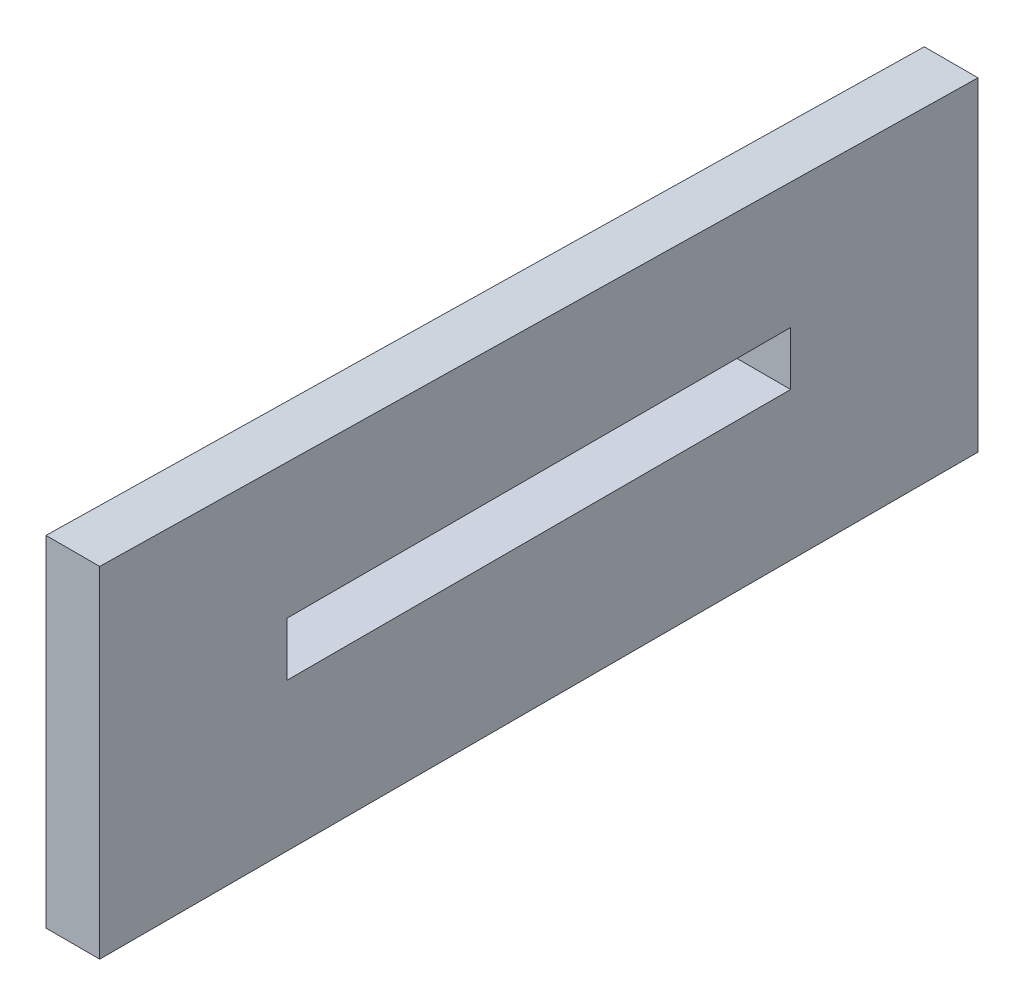
ISO-10303-21;
HEADER;
FILE_DESCRIPTION(('STEP AP214'),'2;1');
FILE_NAME('part.step','',(''),(''),'','','');
FILE_SCHEMA(('AUTOMOTIVE_DESIGN { 1 0 10303 214 1 1 1 1 }'));
ENDSEC;
DATA;
#1=APPLICATION_CONTEXT('core data for automotive mechanical design processes');
#2=APPLICATION_PROTOCOL_DEFINITION('international standard','automotive_design',2000,#1);
#3=PRODUCT_CONTEXT('',#1,'mechanical');
#4=PRODUCT('Part','Part','',(#3));
#5=PRODUCT_RELATED_PRODUCT_CATEGORY('part','',(#4));
#6=PRODUCT_DEFINITION_FORMATION('','',#4);
#7=PRODUCT_DEFINITION_CONTEXT('part definition',#1,'design');
#8=PRODUCT_DEFINITION('design','',#6,#7);
#9=PRODUCT_DEFINITION_SHAPE('','',#8);
#10=(LENGTH_UNIT() NAMED_UNIT(*) SI_UNIT(.MILLI.,.METRE.));
#11=(NAMED_UNIT(*) PLANE_ANGLE_UNIT() SI_UNIT($,.RADIAN.));
#12=(NAMED_UNIT(*) SI_UNIT($,.STERADIAN.) SOLID_ANGLE_UNIT());
#13=UNCERTAINTY_MEASURE_WITH_UNIT(LENGTH_MEASURE(1.E-05),#10,'distance_accuracy_value','');
#14=(GEOMETRIC_REPRESENTATION_CONTEXT(3) GLOBAL_UNCERTAINTY_ASSIGNED_CONTEXT((#13)) GLOBAL_UNIT_ASSIGNED_CONTEXT((#10,
#11,#12)) REPRESENTATION_CONTEXT('',''));
#15=CARTESIAN_POINT('',(0.,0.,0.));
#16=DIRECTION('',(0.,0.,1.));
#17=DIRECTION('',(1.,0.,0.));
#18=AXIS2_PLACEMENT_3D('',#15,#16,#17);
#19=CARTESIAN_POINT('',(3.175,0.,0.));
#20=DIRECTION('',(1.,0.,0.));
#21=DIRECTION('',(0.,0.,-1.));
#22=AXIS2_PLACEMENT_3D('',#19,#20,#21);
#23=PLANE('',#22);
#24=DIRECTION('',(0.,-1.,0.));
#25=VECTOR('',#24,1.);
#26=CARTESIAN_POINT('',(3.175,10.525064421,25.953850429));
#27=LINE('',#26,#25);
#28=CARTESIAN_POINT('',(3.175,10.525064421,25.953850429));
#29=VERTEX_POINT('',#28);
#30=CARTESIAN_POINT('',(3.175,-9.579468141,25.953850429));
#31=VERTEX_POINT('',#30);
#32=EDGE_CURVE('E141',#29,#31,#27,.T.);
#33=ORIENTED_EDGE('',*,*,#32,.T.);
#34=DIRECTION('',(0.,0.,-1.));
#35=VECTOR('',#34,1.);
#36=CARTESIAN_POINT('',(3.175,-9.579468141,25.953850429));
#37=LINE('',#36,#35);
#38=CARTESIAN_POINT('',(3.175,-9.579468141,-25.953850429));
#39=VERTEX_POINT('',#38);
#40=EDGE_CURVE('E144',#31,#39,#37,.T.);
#41=ORIENTED_EDGE('',*,*,#40,.T.);
#42=DIRECTION('',(0.,1.,0.));
#43=VECTOR('',#42,1.);
#44=CARTESIAN_POINT('',(3.175,9.579468141,-25.953850429));
#45=LINE('',#44,#43);
#46=CARTESIAN_POINT('',(3.175,9.579468141,-25.953850429));
#47=VERTEX_POINT('',#46);
#48=EDGE_CURVE('E147',#39,#47,#45,.T.);
#49=ORIENTED_EDGE('',*,*,#48,.T.);
#50=DIRECTION('',(0.,0.0182138565789973,0.99983411395517));
#51=VECTOR('',#50,1.);
#52=CARTESIAN_POINT('',(3.175,9.579468141,-25.953850429));
#53=LINE('',#52,#51);
#54=EDGE_CURVE('E149',#47,#29,#53,.T.);
#55=ORIENTED_EDGE('',*,*,#54,.T.);
#56=EDGE_LOOP('',(#33,#41,#49,#55));
#57=FACE_BOUND('',#56,.T.);
#58=DIRECTION('',(0.,0.,-1.));
#59=VECTOR('',#58,1.);
#60=CARTESIAN_POINT('',(3.175,-0.836413491000002,14.881120987));
#61=LINE('',#60,#59);
#62=CARTESIAN_POINT('',(3.175,-0.836413491000002,14.881120987));
#63=VERTEX_POINT('',#62);
#64=CARTESIAN_POINT('',(3.175,-0.836413491000002,-14.881120987));
#65=VERTEX_POINT('',#64);
#66=EDGE_CURVE('E110',#63,#65,#61,.T.);
#67=ORIENTED_EDGE('',*,*,#66,.F.);
#68=DIRECTION('',(0.,-1.,0.));
#69=VECTOR('',#68,1.);
#70=CARTESIAN_POINT('',(3.175,2.338586509,14.881120987));
#71=LINE('',#70,#69);
#72=CARTESIAN_POINT('',(3.175,2.338586509,14.881120987));
#73=VERTEX_POINT('',#72);
#74=EDGE_CURVE('E102',#73,#63,#71,.T.);
#75=ORIENTED_EDGE('',*,*,#74,.F.);
#76=DIRECTION('',(0.,0.,1.));
#77=VECTOR('',#76,1.);
#78=CARTESIAN_POINT('',(3.175,2.338586509,14.881120987));
#79=LINE('',#78,#77);
#80=CARTESIAN_POINT('',(3.175,2.338586509,-14.881120987));
#81=VERTEX_POINT('',#80);
#82=EDGE_CURVE('E125',#81,#73,#79,.T.);
#83=ORIENTED_EDGE('',*,*,#82,.F.);
#84=DIRECTION('',(0.,1.,0.));
#85=VECTOR('',#84,1.);
#86=CARTESIAN_POINT('',(3.175,2.338586509,-14.881120987));
#87=LINE('',#86,#85);
#88=EDGE_CURVE('E122',#65,#81,#87,.T.);
#89=ORIENTED_EDGE('',*,*,#88,.F.);
#90=EDGE_LOOP('',(#67,#75,#83,#89));
#91=FACE_BOUND('',#90,.T.);
#92=ADVANCED_FACE('F37',(#57,#91),#23,.T.);
#93=CARTESIAN_POINT('',(0.,0.,0.));
#94=DIRECTION('',(1.,0.,0.));
#95=DIRECTION('',(0.,0.,-1.));
#96=AXIS2_PLACEMENT_3D('',#93,#94,#95);
#97=PLANE('',#96);
#98=DIRECTION('',(0.,-1.,0.));
#99=VECTOR('',#98,1.);
#100=CARTESIAN_POINT('',(0.,10.525064421,25.953850429));
#101=LINE('',#100,#99);
#102=CARTESIAN_POINT('',(0.,10.525064421,25.953850429));
#103=VERTEX_POINT('',#102);
#104=CARTESIAN_POINT('',(0.,-9.579468141,25.953850429));
#105=VERTEX_POINT('',#104);
#106=EDGE_CURVE('E118',#103,#105,#101,.T.);
#107=ORIENTED_EDGE('',*,*,#106,.F.);
#108=DIRECTION('',(0.,0.0182138565789973,0.99983411395517));
#109=VECTOR('',#108,1.);
#110=CARTESIAN_POINT('',(0.,9.579468141,-25.953850429));
#111=LINE('',#110,#109);
#112=CARTESIAN_POINT('',(0.,9.579468141,-25.953850429));
#113=VERTEX_POINT('',#112);
#114=EDGE_CURVE('E145',#113,#103,#111,.T.);
#115=ORIENTED_EDGE('',*,*,#114,.F.);
#116=DIRECTION('',(0.,1.,0.));
#117=VECTOR('',#116,1.);
#118=CARTESIAN_POINT('',(0.,9.579468141,-25.953850429));
#119=LINE('',#118,#117);
#120=CARTESIAN_POINT('',(0.,-9.579468141,-25.953850429));
#121=VERTEX_POINT('',#120);
#122=EDGE_CURVE('E156',#121,#113,#119,.T.);
#123=ORIENTED_EDGE('',*,*,#122,.F.);
#124=DIRECTION('',(0.,0.,-1.));
#125=VECTOR('',#124,1.);
#126=CARTESIAN_POINT('',(0.,-9.579468141,25.953850429));
#127=LINE('',#126,#125);
#128=EDGE_CURVE('E154',#105,#121,#127,.T.);
#129=ORIENTED_EDGE('',*,*,#128,.F.);
#130=EDGE_LOOP('',(#107,#115,#123,#129));
#131=FACE_BOUND('',#130,.T.);
#132=DIRECTION('',(0.,-1.,0.));
#133=VECTOR('',#132,1.);
#134=CARTESIAN_POINT('',(0.,2.338586509,14.881120987));
#135=LINE('',#134,#133);
#136=CARTESIAN_POINT('',(0.,2.338586509,14.881120987));
#137=VERTEX_POINT('',#136);
#138=CARTESIAN_POINT('',(0.,-0.836413491000002,14.881120987));
#139=VERTEX_POINT('',#138);
#140=EDGE_CURVE('E60',#137,#139,#135,.T.);
#141=ORIENTED_EDGE('',*,*,#140,.T.);
#142=DIRECTION('',(0.,0.,-1.));
#143=VECTOR('',#142,1.);
#144=CARTESIAN_POINT('',(0.,-0.836413491000002,14.881120987));
#145=LINE('',#144,#143);
#146=CARTESIAN_POINT('',(0.,-0.836413491000002,-14.881120987));
#147=VERTEX_POINT('',#146);
#148=EDGE_CURVE('E117',#139,#147,#145,.T.);
#149=ORIENTED_EDGE('',*,*,#148,.T.);
#150=DIRECTION('',(0.,1.,0.));
#151=VECTOR('',#150,1.);
#152=CARTESIAN_POINT('',(0.,2.338586509,-14.881120987));
#153=LINE('',#152,#151);
#154=CARTESIAN_POINT('',(0.,2.338586509,-14.881120987));
#155=VERTEX_POINT('',#154);
#156=EDGE_CURVE('E131',#147,#155,#153,.T.);
#157=ORIENTED_EDGE('',*,*,#156,.T.);
#158=DIRECTION('',(0.,0.,1.));
#159=VECTOR('',#158,1.);
#160=CARTESIAN_POINT('',(0.,2.338586509,14.881120987));
#161=LINE('',#160,#159);
#162=EDGE_CURVE('E111',#155,#137,#161,.T.);
#163=ORIENTED_EDGE('',*,*,#162,.T.);
#164=EDGE_LOOP('',(#141,#149,#157,#163));
#165=FACE_BOUND('',#164,.T.);
#166=ADVANCED_FACE('F174',(#131,#165),#97,.F.);
#167=CARTESIAN_POINT('',(3.175,10.525064421,25.953850429));
#168=DIRECTION('',(0.,0.,-1.));
#169=DIRECTION('',(-1.,0.,0.));
#170=AXIS2_PLACEMENT_3D('',#167,#168,#169);
#171=PLANE('',#170);
#172=ORIENTED_EDGE('',*,*,#106,.T.);
#173=DIRECTION('',(-1.,0.,0.));
#174=VECTOR('',#173,1.);
#175=CARTESIAN_POINT('',(3.175,-9.579468141,25.953850429));
#176=LINE('',#175,#174);
#177=EDGE_CURVE('E11',#31,#105,#176,.T.);
#178=ORIENTED_EDGE('',*,*,#177,.F.);
#179=ORIENTED_EDGE('',*,*,#32,.F.);
#180=DIRECTION('',(-1.,0.,0.));
#181=VECTOR('',#180,1.);
#182=CARTESIAN_POINT('',(3.175,10.525064421,25.953850429));
#183=LINE('',#182,#181);
#184=EDGE_CURVE('E151',#29,#103,#183,.T.);
#185=ORIENTED_EDGE('',*,*,#184,.T.);
#186=EDGE_LOOP('',(#172,#178,#179,#185));
#187=FACE_BOUND('',#186,.T.);
#188=ADVANCED_FACE('F39',(#187),#171,.F.);
#189=CARTESIAN_POINT('',(3.175,-9.579468141,25.953850429));
#190=DIRECTION('',(0.,1.,0.));
#191=DIRECTION('',(0.,0.,1.));
#192=AXIS2_PLACEMENT_3D('',#189,#190,#191);
#193=PLANE('',#192);
#194=ORIENTED_EDGE('',*,*,#128,.T.);
#195=DIRECTION('',(-1.,0.,0.));
#196=VECTOR('',#195,1.);
#197=CARTESIAN_POINT('',(3.175,-9.579468141,-25.953850429));
#198=LINE('',#197,#196);
#199=EDGE_CURVE('E45',#39,#121,#198,.T.);
#200=ORIENTED_EDGE('',*,*,#199,.F.);
#201=ORIENTED_EDGE('',*,*,#40,.F.);
#202=ORIENTED_EDGE('',*,*,#177,.T.);
#203=EDGE_LOOP('',(#194,#200,#201,#202));
#204=FACE_BOUND('',#203,.T.);
#205=ADVANCED_FACE('F184',(#204),#193,.F.);
#206=CARTESIAN_POINT('',(3.175,9.579468141,-25.953850429));
#207=DIRECTION('',(0.,0.,1.));
#208=DIRECTION('',(0.,-1.,0.));
#209=AXIS2_PLACEMENT_3D('',#206,#207,#208);
#210=PLANE('',#209);
#211=ORIENTED_EDGE('',*,*,#122,.T.);
#212=DIRECTION('',(-1.,0.,0.));
#213=VECTOR('',#212,1.);
#214=CARTESIAN_POINT('',(3.175,9.579468141,-25.953850429));
#215=LINE('',#214,#213);
#216=EDGE_CURVE('E161',#47,#113,#215,.T.);
#217=ORIENTED_EDGE('',*,*,#216,.F.);
#218=ORIENTED_EDGE('',*,*,#48,.F.);
#219=ORIENTED_EDGE('',*,*,#199,.T.);
#220=EDGE_LOOP('',(#211,#217,#218,#219));
#221=FACE_BOUND('',#220,.T.);
#222=ADVANCED_FACE('F168',(#221),#210,.F.);
#223=CARTESIAN_POINT('',(3.175,9.579468141,-25.953850429));
#224=DIRECTION('',(0.,-0.99983411395517,0.0182138565789973));
#225=DIRECTION('',(0.,-0.0182138565789973,-0.99983411395517));
#226=AXIS2_PLACEMENT_3D('',#223,#224,#225);
#227=PLANE('',#226);
#228=ORIENTED_EDGE('',*,*,#114,.T.);
#229=ORIENTED_EDGE('',*,*,#184,.F.);
#230=ORIENTED_EDGE('',*,*,#54,.F.);
#231=ORIENTED_EDGE('',*,*,#216,.T.);
#232=EDGE_LOOP('',(#228,#229,#230,#231));
#233=FACE_BOUND('',#232,.T.);
#234=ADVANCED_FACE('F178',(#233),#227,.F.);
#235=CARTESIAN_POINT('',(3.175,2.338586509,14.881120987));
#236=DIRECTION('',(0.,0.,-1.));
#237=DIRECTION('',(-1.,0.,0.));
#238=AXIS2_PLACEMENT_3D('',#235,#236,#237);
#239=PLANE('',#238);
#240=ORIENTED_EDGE('',*,*,#140,.F.);
#241=DIRECTION('',(-1.,0.,0.));
#242=VECTOR('',#241,1.);
#243=CARTESIAN_POINT('',(3.175,2.338586509,14.881120987));
#244=LINE('',#243,#242);
#245=EDGE_CURVE('E106',#73,#137,#244,.T.);
#246=ORIENTED_EDGE('',*,*,#245,.F.);
#247=ORIENTED_EDGE('',*,*,#74,.T.);
#248=DIRECTION('',(-1.,0.,0.));
#249=VECTOR('',#248,1.);
#250=CARTESIAN_POINT('',(3.175,-0.836413491000002,14.881120987));
#251=LINE('',#250,#249);
#252=EDGE_CURVE('E105',#63,#139,#251,.T.);
#253=ORIENTED_EDGE('',*,*,#252,.T.);
#254=EDGE_LOOP('',(#240,#246,#247,#253));
#255=FACE_BOUND('',#254,.T.);
#256=ADVANCED_FACE('F104',(#255),#239,.T.);
#257=CARTESIAN_POINT('',(3.175,-0.836413491000002,14.881120987));
#258=DIRECTION('',(0.,1.,0.));
#259=DIRECTION('',(0.,0.,1.));
#260=AXIS2_PLACEMENT_3D('',#257,#258,#259);
#261=PLANE('',#260);
#262=ORIENTED_EDGE('',*,*,#148,.F.);
#263=ORIENTED_EDGE('',*,*,#252,.F.);
#264=ORIENTED_EDGE('',*,*,#66,.T.);
#265=DIRECTION('',(-1.,0.,0.));
#266=VECTOR('',#265,1.);
#267=CARTESIAN_POINT('',(3.175,-0.836413491000002,-14.881120987));
#268=LINE('',#267,#266);
#269=EDGE_CURVE('E119',#65,#147,#268,.T.);
#270=ORIENTED_EDGE('',*,*,#269,.T.);
#271=EDGE_LOOP('',(#262,#263,#264,#270));
#272=FACE_BOUND('',#271,.T.);
#273=ADVANCED_FACE('F114',(#272),#261,.T.);
#274=CARTESIAN_POINT('',(3.175,2.338586509,-14.881120987));
#275=DIRECTION('',(0.,0.,1.));
#276=DIRECTION('',(1.,0.,0.));
#277=AXIS2_PLACEMENT_3D('',#274,#275,#276);
#278=PLANE('',#277);
#279=ORIENTED_EDGE('',*,*,#156,.F.);
#280=ORIENTED_EDGE('',*,*,#269,.F.);
#281=ORIENTED_EDGE('',*,*,#88,.T.);
#282=DIRECTION('',(-1.,0.,0.));
#283=VECTOR('',#282,1.);
#284=CARTESIAN_POINT('',(3.175,2.338586509,-14.881120987));
#285=LINE('',#284,#283);
#286=EDGE_CURVE('E52',#81,#155,#285,.T.);
#287=ORIENTED_EDGE('',*,*,#286,.T.);
#288=EDGE_LOOP('',(#279,#280,#281,#287));
#289=FACE_BOUND('',#288,.T.);
#290=ADVANCED_FACE('F207',(#289),#278,.T.);
#291=CARTESIAN_POINT('',(3.175,2.338586509,14.881120987));
#292=DIRECTION('',(0.,-1.,0.));
#293=DIRECTION('',(0.,0.,-1.));
#294=AXIS2_PLACEMENT_3D('',#291,#292,#293);
#295=PLANE('',#294);
#296=ORIENTED_EDGE('',*,*,#162,.F.);
#297=ORIENTED_EDGE('',*,*,#286,.F.);
#298=ORIENTED_EDGE('',*,*,#82,.T.);
#299=ORIENTED_EDGE('',*,*,#245,.T.);
#300=EDGE_LOOP('',(#296,#297,#298,#299));
#301=FACE_BOUND('',#300,.T.);
#302=ADVANCED_FACE('F211',(#301),#295,.T.);
#303=CLOSED_SHELL('',(#92,#166,#188,#205,#222,#234,#256,#273,#290,#302));
#304=MANIFOLD_SOLID_BREP('B2',#303);
#305=ADVANCED_BREP_SHAPE_REPRESENTATION('',(#18,#304),#14);
#306=SHAPE_DEFINITION_REPRESENTATION(#9,#305);
ENDSEC;
END-ISO-10303-21;
